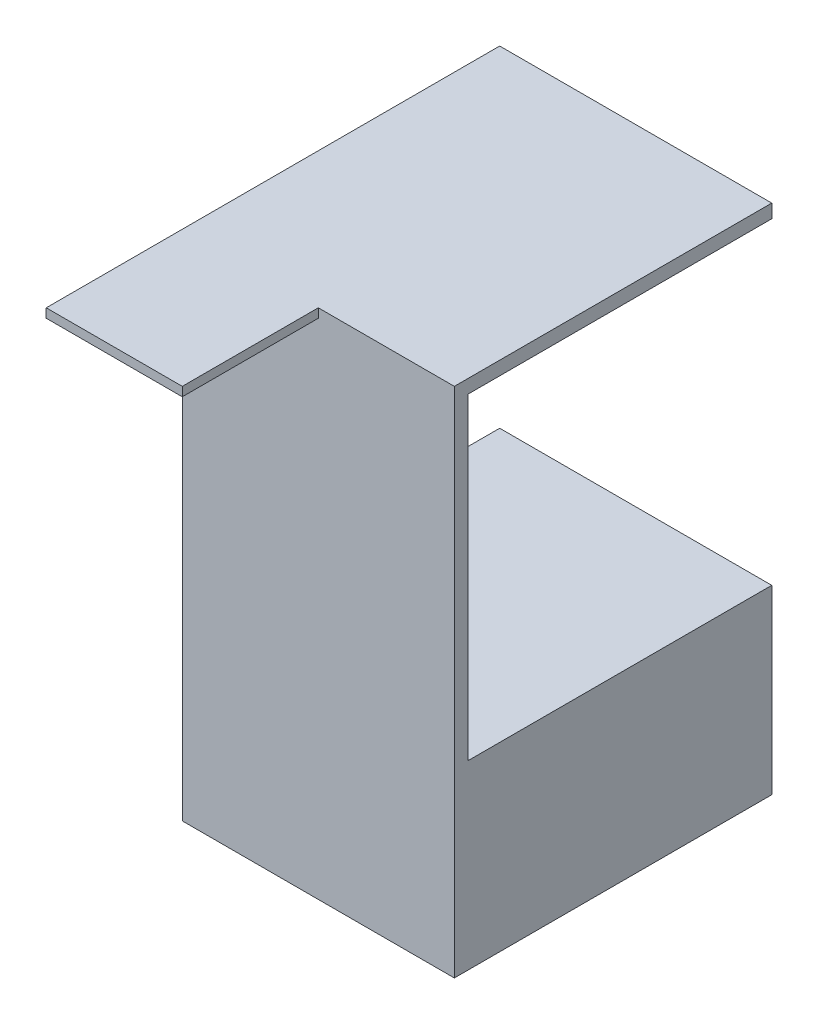
ISO-10303-21;
HEADER;
FILE_DESCRIPTION(('STEP AP214'),'2;1');
FILE_NAME('part.step','',(''),(''),'','','');
FILE_SCHEMA(('AUTOMOTIVE_DESIGN { 1 0 10303 214 1 1 1 1 }'));
ENDSEC;
DATA;
#1=APPLICATION_CONTEXT('core data for automotive mechanical design processes');
#2=APPLICATION_PROTOCOL_DEFINITION('international standard','automotive_design',2000,#1);
#3=PRODUCT_CONTEXT('',#1,'mechanical');
#4=PRODUCT('Part','Part','',(#3));
#5=PRODUCT_RELATED_PRODUCT_CATEGORY('part','',(#4));
#6=PRODUCT_DEFINITION_FORMATION('','',#4);
#7=PRODUCT_DEFINITION_CONTEXT('part definition',#1,'design');
#8=PRODUCT_DEFINITION('design','',#6,#7);
#9=PRODUCT_DEFINITION_SHAPE('','',#8);
#10=(LENGTH_UNIT() NAMED_UNIT(*) SI_UNIT(.MILLI.,.METRE.));
#11=(NAMED_UNIT(*) PLANE_ANGLE_UNIT() SI_UNIT($,.RADIAN.));
#12=(NAMED_UNIT(*) SI_UNIT($,.STERADIAN.) SOLID_ANGLE_UNIT());
#13=UNCERTAINTY_MEASURE_WITH_UNIT(LENGTH_MEASURE(1.E-05),#10,'distance_accuracy_value','');
#14=(GEOMETRIC_REPRESENTATION_CONTEXT(3) GLOBAL_UNCERTAINTY_ASSIGNED_CONTEXT((#13)) GLOBAL_UNIT_ASSIGNED_CONTEXT((#10,
#11,#12)) REPRESENTATION_CONTEXT('',''));
#15=CARTESIAN_POINT('',(0.,0.,0.));
#16=DIRECTION('',(0.,0.,1.));
#17=DIRECTION('',(1.,0.,0.));
#18=AXIS2_PLACEMENT_3D('',#15,#16,#17);
#19=CARTESIAN_POINT('',(-300.,-350.,30.));
#20=DIRECTION('',(1.,0.,0.));
#21=DIRECTION('',(0.,0.,-1.));
#22=AXIS2_PLACEMENT_3D('',#19,#20,#21);
#23=PLANE('',#22);
#24=DIRECTION('',(0.,-1.,0.));
#25=VECTOR('',#24,1.);
#26=CARTESIAN_POINT('',(-300.,-350.,0.));
#27=LINE('',#26,#25);
#28=CARTESIAN_POINT('',(-300.,350.,0.));
#29=VERTEX_POINT('',#28);
#30=CARTESIAN_POINT('',(-300.,-350.,0.));
#31=VERTEX_POINT('',#30);
#32=EDGE_CURVE('E200',#29,#31,#27,.T.);
#33=ORIENTED_EDGE('',*,*,#32,.T.);
#34=DIRECTION('',(0.,0.,1.));
#35=VECTOR('',#34,1.);
#36=CARTESIAN_POINT('',(-300.,-350.,-670.));
#37=LINE('',#36,#35);
#38=CARTESIAN_POINT('',(-300.,-350.,-670.));
#39=VERTEX_POINT('',#38);
#40=EDGE_CURVE('E163',#39,#31,#37,.T.);
#41=ORIENTED_EDGE('',*,*,#40,.F.);
#42=DIRECTION('',(0.,-1.,0.));
#43=VECTOR('',#42,1.);
#44=CARTESIAN_POINT('',(-300.,-350.,-670.));
#45=LINE('',#44,#43);
#46=CARTESIAN_POINT('',(-300.,-750.,-670.));
#47=VERTEX_POINT('',#46);
#48=EDGE_CURVE('E148',#39,#47,#45,.T.);
#49=ORIENTED_EDGE('',*,*,#48,.T.);
#50=DIRECTION('',(0.,0.,1.));
#51=VECTOR('',#50,1.);
#52=CARTESIAN_POINT('',(-300.,-750.,-670.));
#53=LINE('',#52,#51);
#54=CARTESIAN_POINT('',(-300.,-750.,30.));
#55=VERTEX_POINT('',#54);
#56=EDGE_CURVE('E165',#47,#55,#53,.T.);
#57=ORIENTED_EDGE('',*,*,#56,.T.);
#58=DIRECTION('',(0.,-1.,0.));
#59=VECTOR('',#58,1.);
#60=CARTESIAN_POINT('',(-300.,-350.,30.));
#61=LINE('',#60,#59);
#62=CARTESIAN_POINT('',(-300.,360.,30.));
#63=VERTEX_POINT('',#62);
#64=EDGE_CURVE('E50',#63,#55,#61,.T.);
#65=ORIENTED_EDGE('',*,*,#64,.F.);
#66=DIRECTION('',(0.,0.,-1.));
#67=VECTOR('',#66,1.);
#68=CARTESIAN_POINT('',(-300.,360.,330.));
#69=LINE('',#68,#67);
#70=CARTESIAN_POINT('',(-300.,360.,330.));
#71=VERTEX_POINT('',#70);
#72=EDGE_CURVE('E125',#71,#63,#69,.T.);
#73=ORIENTED_EDGE('',*,*,#72,.F.);
#74=DIRECTION('',(0.,-1.,0.));
#75=VECTOR('',#74,1.);
#76=CARTESIAN_POINT('',(-300.,380.,330.));
#77=LINE('',#76,#75);
#78=CARTESIAN_POINT('',(-300.,380.,330.));
#79=VERTEX_POINT('',#78);
#80=EDGE_CURVE('E132',#79,#71,#77,.T.);
#81=ORIENTED_EDGE('',*,*,#80,.F.);
#82=DIRECTION('',(0.,0.,1.));
#83=VECTOR('',#82,1.);
#84=CARTESIAN_POINT('',(-300.,380.,30.));
#85=LINE('',#84,#83);
#86=CARTESIAN_POINT('',(-300.,380.,-670.));
#87=VERTEX_POINT('',#86);
#88=EDGE_CURVE('E182',#87,#79,#85,.T.);
#89=ORIENTED_EDGE('',*,*,#88,.F.);
#90=DIRECTION('',(0.,-1.,0.));
#91=VECTOR('',#90,1.);
#92=CARTESIAN_POINT('',(-300.,380.,-670.));
#93=LINE('',#92,#91);
#94=CARTESIAN_POINT('',(-300.,350.,-670.));
#95=VERTEX_POINT('',#94);
#96=EDGE_CURVE('E184',#87,#95,#93,.T.);
#97=ORIENTED_EDGE('',*,*,#96,.T.);
#98=DIRECTION('',(0.,0.,1.));
#99=VECTOR('',#98,1.);
#100=CARTESIAN_POINT('',(-300.,350.,30.));
#101=LINE('',#100,#99);
#102=EDGE_CURVE('E178',#95,#29,#101,.T.);
#103=ORIENTED_EDGE('',*,*,#102,.T.);
#104=EDGE_LOOP('',(#33,#41,#49,#57,#65,#73,#81,#89,#97,#103));
#105=FACE_BOUND('',#104,.T.);
#106=ADVANCED_FACE('F39',(#105),#23,.F.);
#107=CARTESIAN_POINT('',(300.,-350.,30.));
#108=DIRECTION('',(-1.,0.,0.));
#109=DIRECTION('',(0.,0.,1.));
#110=AXIS2_PLACEMENT_3D('',#107,#108,#109);
#111=PLANE('',#110);
#112=DIRECTION('',(0.,1.,0.));
#113=VECTOR('',#112,1.);
#114=CARTESIAN_POINT('',(300.,-350.,0.));
#115=LINE('',#114,#113);
#116=CARTESIAN_POINT('',(300.,-350.,0.));
#117=VERTEX_POINT('',#116);
#118=CARTESIAN_POINT('',(300.,350.,0.));
#119=VERTEX_POINT('',#118);
#120=EDGE_CURVE('E45',#117,#119,#115,.T.);
#121=ORIENTED_EDGE('',*,*,#120,.T.);
#122=DIRECTION('',(0.,0.,-1.));
#123=VECTOR('',#122,1.);
#124=CARTESIAN_POINT('',(300.,350.,30.));
#125=LINE('',#124,#123);
#126=CARTESIAN_POINT('',(300.,350.,-670.));
#127=VERTEX_POINT('',#126);
#128=EDGE_CURVE('E170',#119,#127,#125,.T.);
#129=ORIENTED_EDGE('',*,*,#128,.T.);
#130=DIRECTION('',(0.,-1.,0.));
#131=VECTOR('',#130,1.);
#132=CARTESIAN_POINT('',(300.,380.,-670.));
#133=LINE('',#132,#131);
#134=CARTESIAN_POINT('',(300.,380.,-670.));
#135=VERTEX_POINT('',#134);
#136=EDGE_CURVE('E192',#135,#127,#133,.T.);
#137=ORIENTED_EDGE('',*,*,#136,.F.);
#138=DIRECTION('',(0.,0.,-1.));
#139=VECTOR('',#138,1.);
#140=CARTESIAN_POINT('',(300.,380.,30.));
#141=LINE('',#140,#139);
#142=CARTESIAN_POINT('',(300.,380.,30.));
#143=VERTEX_POINT('',#142);
#144=EDGE_CURVE('E173',#143,#135,#141,.T.);
#145=ORIENTED_EDGE('',*,*,#144,.F.);
#146=DIRECTION('',(0.,1.,0.));
#147=VECTOR('',#146,1.);
#148=CARTESIAN_POINT('',(300.,-350.,30.));
#149=LINE('',#148,#147);
#150=CARTESIAN_POINT('',(300.,-750.,30.));
#151=VERTEX_POINT('',#150);
#152=EDGE_CURVE('E11',#151,#143,#149,.T.);
#153=ORIENTED_EDGE('',*,*,#152,.F.);
#154=DIRECTION('',(0.,0.,1.));
#155=VECTOR('',#154,1.);
#156=CARTESIAN_POINT('',(300.,-750.,-670.));
#157=LINE('',#156,#155);
#158=CARTESIAN_POINT('',(300.,-750.,-670.));
#159=VERTEX_POINT('',#158);
#160=EDGE_CURVE('E172',#159,#151,#157,.T.);
#161=ORIENTED_EDGE('',*,*,#160,.F.);
#162=DIRECTION('',(0.,1.,0.));
#163=VECTOR('',#162,1.);
#164=CARTESIAN_POINT('',(300.,-350.,-670.));
#165=LINE('',#164,#163);
#166=CARTESIAN_POINT('',(300.,-350.,-670.));
#167=VERTEX_POINT('',#166);
#168=EDGE_CURVE('E160',#159,#167,#165,.T.);
#169=ORIENTED_EDGE('',*,*,#168,.T.);
#170=DIRECTION('',(0.,0.,1.));
#171=VECTOR('',#170,1.);
#172=CARTESIAN_POINT('',(300.,-350.,-670.));
#173=LINE('',#172,#171);
#174=EDGE_CURVE('E169',#167,#117,#173,.T.);
#175=ORIENTED_EDGE('',*,*,#174,.T.);
#176=EDGE_LOOP('',(#121,#129,#137,#145,#153,#161,#169,#175));
#177=FACE_BOUND('',#176,.T.);
#178=ADVANCED_FACE('F206',(#177),#111,.F.);
#179=CARTESIAN_POINT('',(0.,0.,30.));
#180=DIRECTION('',(0.,0.,1.));
#181=DIRECTION('',(1.,0.,0.));
#182=AXIS2_PLACEMENT_3D('',#179,#180,#181);
#183=PLANE('',#182);
#184=DIRECTION('',(0.,1.,0.));
#185=VECTOR('',#184,1.);
#186=CARTESIAN_POINT('',(0.,380.,30.));
#187=LINE('',#186,#185);
#188=CARTESIAN_POINT('',(0.,360.,30.));
#189=VERTEX_POINT('',#188);
#190=CARTESIAN_POINT('',(0.,380.,30.));
#191=VERTEX_POINT('',#190);
#192=EDGE_CURVE('E140',#189,#191,#187,.T.);
#193=ORIENTED_EDGE('',*,*,#192,.F.);
#194=DIRECTION('',(1.,0.,0.));
#195=VECTOR('',#194,1.);
#196=CARTESIAN_POINT('',(-300.,360.,30.));
#197=LINE('',#196,#195);
#198=EDGE_CURVE('E54',#63,#189,#197,.T.);
#199=ORIENTED_EDGE('',*,*,#198,.F.);
#200=ORIENTED_EDGE('',*,*,#64,.T.);
#201=DIRECTION('',(1.,0.,0.));
#202=VECTOR('',#201,1.);
#203=CARTESIAN_POINT('',(-300.,-750.,30.));
#204=LINE('',#203,#202);
#205=EDGE_CURVE('E141',#55,#151,#204,.T.);
#206=ORIENTED_EDGE('',*,*,#205,.T.);
#207=ORIENTED_EDGE('',*,*,#152,.T.);
#208=DIRECTION('',(1.,0.,0.));
#209=VECTOR('',#208,1.);
#210=CARTESIAN_POINT('',(300.,380.,30.));
#211=LINE('',#210,#209);
#212=EDGE_CURVE('E58',#191,#143,#211,.T.);
#213=ORIENTED_EDGE('',*,*,#212,.F.);
#214=EDGE_LOOP('',(#193,#199,#200,#206,#207,#213));
#215=FACE_BOUND('',#214,.T.);
#216=ADVANCED_FACE('F224',(#215),#183,.T.);
#217=CARTESIAN_POINT('',(0.,0.,0.));
#218=DIRECTION('',(0.,0.,1.));
#219=DIRECTION('',(1.,0.,0.));
#220=AXIS2_PLACEMENT_3D('',#217,#218,#219);
#221=PLANE('',#220);
#222=DIRECTION('',(-1.,0.,0.));
#223=VECTOR('',#222,1.);
#224=CARTESIAN_POINT('',(-300.,350.,0.));
#225=LINE('',#224,#223);
#226=EDGE_CURVE('E195',#119,#29,#225,.T.);
#227=ORIENTED_EDGE('',*,*,#226,.F.);
#228=ORIENTED_EDGE('',*,*,#120,.F.);
#229=DIRECTION('',(1.,0.,0.));
#230=VECTOR('',#229,1.);
#231=CARTESIAN_POINT('',(-300.,-350.,0.));
#232=LINE('',#231,#230);
#233=EDGE_CURVE('E199',#31,#117,#232,.T.);
#234=ORIENTED_EDGE('',*,*,#233,.F.);
#235=ORIENTED_EDGE('',*,*,#32,.F.);
#236=EDGE_LOOP('',(#227,#228,#234,#235));
#237=FACE_BOUND('',#236,.T.);
#238=ADVANCED_FACE('F211',(#237),#221,.F.);
#239=CARTESIAN_POINT('',(0.,350.,0.));
#240=DIRECTION('',(0.,1.,0.));
#241=DIRECTION('',(-1.,0.,0.));
#242=AXIS2_PLACEMENT_3D('',#239,#240,#241);
#243=PLANE('',#242);
#244=ORIENTED_EDGE('',*,*,#128,.F.);
#245=ORIENTED_EDGE('',*,*,#226,.T.);
#246=ORIENTED_EDGE('',*,*,#102,.F.);
#247=DIRECTION('',(-1.,0.,0.));
#248=VECTOR('',#247,1.);
#249=CARTESIAN_POINT('',(300.,350.,-670.));
#250=LINE('',#249,#248);
#251=EDGE_CURVE('E187',#127,#95,#250,.T.);
#252=ORIENTED_EDGE('',*,*,#251,.F.);
#253=EDGE_LOOP('',(#244,#245,#246,#252));
#254=FACE_BOUND('',#253,.T.);
#255=ADVANCED_FACE('F212',(#254),#243,.F.);
#256=CARTESIAN_POINT('',(300.,380.,-670.));
#257=DIRECTION('',(0.,0.,1.));
#258=DIRECTION('',(1.,0.,0.));
#259=AXIS2_PLACEMENT_3D('',#256,#257,#258);
#260=PLANE('',#259);
#261=ORIENTED_EDGE('',*,*,#251,.T.);
#262=ORIENTED_EDGE('',*,*,#96,.F.);
#263=DIRECTION('',(-1.,0.,0.));
#264=VECTOR('',#263,1.);
#265=CARTESIAN_POINT('',(300.,380.,-670.));
#266=LINE('',#265,#264);
#267=EDGE_CURVE('E179',#135,#87,#266,.T.);
#268=ORIENTED_EDGE('',*,*,#267,.F.);
#269=ORIENTED_EDGE('',*,*,#136,.T.);
#270=EDGE_LOOP('',(#261,#262,#268,#269));
#271=FACE_BOUND('',#270,.T.);
#272=ADVANCED_FACE('F220',(#271),#260,.F.);
#273=CARTESIAN_POINT('',(0.,380.,0.));
#274=DIRECTION('',(0.,1.,0.));
#275=DIRECTION('',(-1.,0.,0.));
#276=AXIS2_PLACEMENT_3D('',#273,#274,#275);
#277=PLANE('',#276);
#278=ORIENTED_EDGE('',*,*,#144,.T.);
#279=ORIENTED_EDGE('',*,*,#267,.T.);
#280=ORIENTED_EDGE('',*,*,#88,.T.);
#281=DIRECTION('',(-1.,0.,0.));
#282=VECTOR('',#281,1.);
#283=CARTESIAN_POINT('',(-300.,380.,330.));
#284=LINE('',#283,#282);
#285=CARTESIAN_POINT('',(0.,380.,330.));
#286=VERTEX_POINT('',#285);
#287=EDGE_CURVE('E137',#286,#79,#284,.T.);
#288=ORIENTED_EDGE('',*,*,#287,.F.);
#289=DIRECTION('',(0.,0.,-1.));
#290=VECTOR('',#289,1.);
#291=CARTESIAN_POINT('',(0.,380.,330.));
#292=LINE('',#291,#290);
#293=EDGE_CURVE('E146',#286,#191,#292,.T.);
#294=ORIENTED_EDGE('',*,*,#293,.T.);
#295=ORIENTED_EDGE('',*,*,#212,.T.);
#296=EDGE_LOOP('',(#278,#279,#280,#288,#294,#295));
#297=FACE_BOUND('',#296,.T.);
#298=ADVANCED_FACE('F219',(#297),#277,.T.);
#299=CARTESIAN_POINT('',(-300.,-350.,-670.));
#300=DIRECTION('',(0.,1.,0.));
#301=DIRECTION('',(0.,0.,1.));
#302=AXIS2_PLACEMENT_3D('',#299,#300,#301);
#303=PLANE('',#302);
#304=ORIENTED_EDGE('',*,*,#40,.T.);
#305=ORIENTED_EDGE('',*,*,#233,.T.);
#306=ORIENTED_EDGE('',*,*,#174,.F.);
#307=DIRECTION('',(-1.,0.,0.));
#308=VECTOR('',#307,1.);
#309=CARTESIAN_POINT('',(-300.,-350.,-670.));
#310=LINE('',#309,#308);
#311=EDGE_CURVE('E159',#167,#39,#310,.T.);
#312=ORIENTED_EDGE('',*,*,#311,.T.);
#313=EDGE_LOOP('',(#304,#305,#306,#312));
#314=FACE_BOUND('',#313,.T.);
#315=ADVANCED_FACE('F234',(#314),#303,.T.);
#316=CARTESIAN_POINT('',(-300.,-750.,-670.));
#317=DIRECTION('',(0.,-1.,0.));
#318=DIRECTION('',(0.,0.,-1.));
#319=AXIS2_PLACEMENT_3D('',#316,#317,#318);
#320=PLANE('',#319);
#321=ORIENTED_EDGE('',*,*,#205,.F.);
#322=ORIENTED_EDGE('',*,*,#56,.F.);
#323=DIRECTION('',(1.,0.,0.));
#324=VECTOR('',#323,1.);
#325=CARTESIAN_POINT('',(-300.,-750.,-670.));
#326=LINE('',#325,#324);
#327=EDGE_CURVE('E152',#47,#159,#326,.T.);
#328=ORIENTED_EDGE('',*,*,#327,.T.);
#329=ORIENTED_EDGE('',*,*,#160,.T.);
#330=EDGE_LOOP('',(#321,#322,#328,#329));
#331=FACE_BOUND('',#330,.T.);
#332=ADVANCED_FACE('F227',(#331),#320,.T.);
#333=CARTESIAN_POINT('',(0.,0.,-670.));
#334=DIRECTION('',(0.,0.,1.));
#335=DIRECTION('',(1.,0.,0.));
#336=AXIS2_PLACEMENT_3D('',#333,#334,#335);
#337=PLANE('',#336);
#338=ORIENTED_EDGE('',*,*,#48,.F.);
#339=ORIENTED_EDGE('',*,*,#311,.F.);
#340=ORIENTED_EDGE('',*,*,#168,.F.);
#341=ORIENTED_EDGE('',*,*,#327,.F.);
#342=EDGE_LOOP('',(#338,#339,#340,#341));
#343=FACE_BOUND('',#342,.T.);
#344=ADVANCED_FACE('F232',(#343),#337,.F.);
#345=CARTESIAN_POINT('',(-300.,360.,330.));
#346=DIRECTION('',(0.,1.,0.));
#347=DIRECTION('',(0.,0.,1.));
#348=AXIS2_PLACEMENT_3D('',#345,#346,#347);
#349=PLANE('',#348);
#350=ORIENTED_EDGE('',*,*,#198,.T.);
#351=DIRECTION('',(0.,0.,-1.));
#352=VECTOR('',#351,1.);
#353=CARTESIAN_POINT('',(0.,360.,330.));
#354=LINE('',#353,#352);
#355=CARTESIAN_POINT('',(0.,360.,330.));
#356=VERTEX_POINT('',#355);
#357=EDGE_CURVE('E130',#356,#189,#354,.T.);
#358=ORIENTED_EDGE('',*,*,#357,.F.);
#359=DIRECTION('',(1.,0.,0.));
#360=VECTOR('',#359,1.);
#361=CARTESIAN_POINT('',(-300.,360.,330.));
#362=LINE('',#361,#360);
#363=EDGE_CURVE('E121',#71,#356,#362,.T.);
#364=ORIENTED_EDGE('',*,*,#363,.F.);
#365=ORIENTED_EDGE('',*,*,#72,.T.);
#366=EDGE_LOOP('',(#350,#358,#364,#365));
#367=FACE_BOUND('',#366,.T.);
#368=ADVANCED_FACE('F124',(#367),#349,.F.);
#369=CARTESIAN_POINT('',(0.,380.,330.));
#370=DIRECTION('',(-1.,0.,0.));
#371=DIRECTION('',(0.,0.,1.));
#372=AXIS2_PLACEMENT_3D('',#369,#370,#371);
#373=PLANE('',#372);
#374=ORIENTED_EDGE('',*,*,#192,.T.);
#375=ORIENTED_EDGE('',*,*,#293,.F.);
#376=DIRECTION('',(0.,1.,0.));
#377=VECTOR('',#376,1.);
#378=CARTESIAN_POINT('',(0.,380.,330.));
#379=LINE('',#378,#377);
#380=EDGE_CURVE('E128',#356,#286,#379,.T.);
#381=ORIENTED_EDGE('',*,*,#380,.F.);
#382=ORIENTED_EDGE('',*,*,#357,.T.);
#383=EDGE_LOOP('',(#374,#375,#381,#382));
#384=FACE_BOUND('',#383,.T.);
#385=ADVANCED_FACE('F239',(#384),#373,.F.);
#386=CARTESIAN_POINT('',(0.,0.,330.));
#387=DIRECTION('',(0.,0.,1.));
#388=DIRECTION('',(1.,0.,0.));
#389=AXIS2_PLACEMENT_3D('',#386,#387,#388);
#390=PLANE('',#389);
#391=ORIENTED_EDGE('',*,*,#80,.T.);
#392=ORIENTED_EDGE('',*,*,#363,.T.);
#393=ORIENTED_EDGE('',*,*,#380,.T.);
#394=ORIENTED_EDGE('',*,*,#287,.T.);
#395=EDGE_LOOP('',(#391,#392,#393,#394));
#396=FACE_BOUND('',#395,.T.);
#397=ADVANCED_FACE('F133',(#396),#390,.T.);
#398=CLOSED_SHELL('',(#106,#178,#216,#238,#255,#272,#298,#315,#332,#344,#368,#385,#397));
#399=MANIFOLD_SOLID_BREP('B2',#398);
#400=ADVANCED_BREP_SHAPE_REPRESENTATION('',(#18,#399),#14);
#401=SHAPE_DEFINITION_REPRESENTATION(#9,#400);
ENDSEC;
END-ISO-10303-21;
